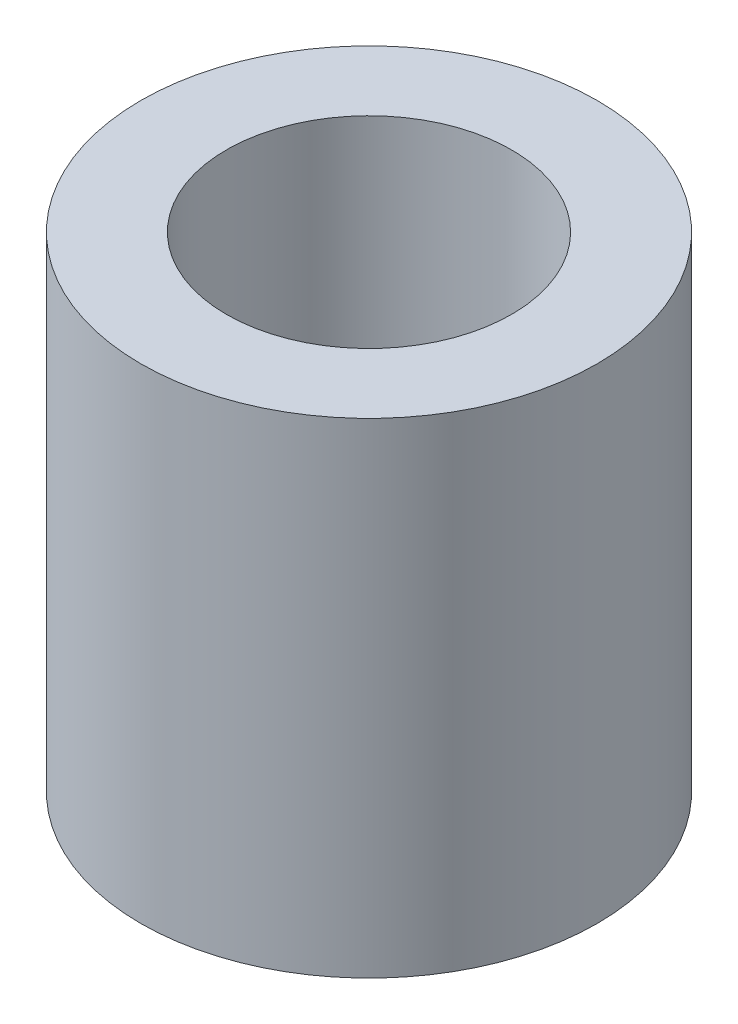
ISO-10303-21;
HEADER;
FILE_DESCRIPTION(('STEP AP214'),'2;1');
FILE_NAME('part.step','',(''),(''),'','','');
FILE_SCHEMA(('AUTOMOTIVE_DESIGN { 1 0 10303 214 1 1 1 1 }'));
ENDSEC;
DATA;
#1=APPLICATION_CONTEXT('core data for automotive mechanical design processes');
#2=APPLICATION_PROTOCOL_DEFINITION('international standard','automotive_design',2000,#1);
#3=PRODUCT_CONTEXT('',#1,'mechanical');
#4=PRODUCT('Part','Part','',(#3));
#5=PRODUCT_RELATED_PRODUCT_CATEGORY('part','',(#4));
#6=PRODUCT_DEFINITION_FORMATION('','',#4);
#7=PRODUCT_DEFINITION_CONTEXT('part definition',#1,'design');
#8=PRODUCT_DEFINITION('design','',#6,#7);
#9=PRODUCT_DEFINITION_SHAPE('','',#8);
#10=(LENGTH_UNIT() NAMED_UNIT(*) SI_UNIT(.MILLI.,.METRE.));
#11=(NAMED_UNIT(*) PLANE_ANGLE_UNIT() SI_UNIT($,.RADIAN.));
#12=(NAMED_UNIT(*) SI_UNIT($,.STERADIAN.) SOLID_ANGLE_UNIT());
#13=UNCERTAINTY_MEASURE_WITH_UNIT(LENGTH_MEASURE(1.E-05),#10,'distance_accuracy_value','');
#14=(GEOMETRIC_REPRESENTATION_CONTEXT(3) GLOBAL_UNCERTAINTY_ASSIGNED_CONTEXT((#13)) GLOBAL_UNIT_ASSIGNED_CONTEXT((#10,
#11,#12)) REPRESENTATION_CONTEXT('',''));
#15=CARTESIAN_POINT('',(0.,0.,0.));
#16=DIRECTION('',(0.,0.,1.));
#17=DIRECTION('',(1.,0.,0.));
#18=AXIS2_PLACEMENT_3D('',#15,#16,#17);
#19=CARTESIAN_POINT('',(0.,8.5,0.));
#20=DIRECTION('',(0.,1.,0.));
#21=DIRECTION('',(0.,0.,1.));
#22=AXIS2_PLACEMENT_3D('',#19,#20,#21);
#23=PLANE('',#22);
#24=CARTESIAN_POINT('',(0.,8.5,0.));
#25=DIRECTION('',(0.,1.,0.));
#26=DIRECTION('',(0.,0.,1.));
#27=AXIS2_PLACEMENT_3D('',#24,#25,#26);
#28=CIRCLE('',#27,4.);
#29=CARTESIAN_POINT('',(0.,8.5,4.));
#30=VERTEX_POINT('',#29);
#31=EDGE_CURVE('E10',#30,#30,#28,.T.);
#32=ORIENTED_EDGE('',*,*,#31,.T.);
#33=EDGE_LOOP('',(#32));
#34=FACE_BOUND('',#33,.T.);
#35=CARTESIAN_POINT('',(0.,8.5,0.));
#36=DIRECTION('',(0.,1.,0.));
#37=DIRECTION('',(0.,0.,1.));
#38=AXIS2_PLACEMENT_3D('',#35,#36,#37);
#39=CIRCLE('',#38,2.5);
#40=CARTESIAN_POINT('',(0.,8.5,2.5));
#41=VERTEX_POINT('',#40);
#42=EDGE_CURVE('E50',#41,#41,#39,.T.);
#43=ORIENTED_EDGE('',*,*,#42,.F.);
#44=EDGE_LOOP('',(#43));
#45=FACE_BOUND('',#44,.T.);
#46=ADVANCED_FACE('F37',(#34,#45),#23,.T.);
#47=CARTESIAN_POINT('',(0.,0.,0.));
#48=DIRECTION('',(0.,1.,0.));
#49=DIRECTION('',(0.,0.,1.));
#50=AXIS2_PLACEMENT_3D('',#47,#48,#49);
#51=PLANE('',#50);
#52=CARTESIAN_POINT('',(0.,0.,0.));
#53=DIRECTION('',(0.,1.,0.));
#54=DIRECTION('',(0.,0.,1.));
#55=AXIS2_PLACEMENT_3D('',#52,#53,#54);
#56=CIRCLE('',#55,4.);
#57=CARTESIAN_POINT('',(0.,0.,4.));
#58=VERTEX_POINT('',#57);
#59=EDGE_CURVE('E41',#58,#58,#56,.T.);
#60=ORIENTED_EDGE('',*,*,#59,.F.);
#61=EDGE_LOOP('',(#60));
#62=FACE_BOUND('',#61,.T.);
#63=CARTESIAN_POINT('',(0.,0.,0.));
#64=DIRECTION('',(0.,1.,0.));
#65=DIRECTION('',(0.,0.,1.));
#66=AXIS2_PLACEMENT_3D('',#63,#64,#65);
#67=CIRCLE('',#66,2.5);
#68=CARTESIAN_POINT('',(0.,0.,2.5));
#69=VERTEX_POINT('',#68);
#70=EDGE_CURVE('E52',#69,#69,#67,.T.);
#71=ORIENTED_EDGE('',*,*,#70,.T.);
#72=EDGE_LOOP('',(#71));
#73=FACE_BOUND('',#72,.T.);
#74=ADVANCED_FACE('F64',(#62,#73),#51,.F.);
#75=CARTESIAN_POINT('',(0.,8.5,0.));
#76=DIRECTION('',(0.,-1.,0.));
#77=DIRECTION('',(0.,0.,-1.));
#78=AXIS2_PLACEMENT_3D('',#75,#76,#77);
#79=CYLINDRICAL_SURFACE('',#78,4.);
#80=ORIENTED_EDGE('',*,*,#31,.F.);
#81=EDGE_LOOP('',(#80));
#82=FACE_BOUND('',#81,.T.);
#83=ORIENTED_EDGE('',*,*,#59,.T.);
#84=EDGE_LOOP('',(#83));
#85=FACE_BOUND('',#84,.T.);
#86=ADVANCED_FACE('F39',(#82,#85),#79,.T.);
#87=CARTESIAN_POINT('',(0.,8.5,0.));
#88=DIRECTION('',(0.,-1.,0.));
#89=DIRECTION('',(0.,0.,-1.));
#90=AXIS2_PLACEMENT_3D('',#87,#88,#89);
#91=CYLINDRICAL_SURFACE('',#90,2.5);
#92=ORIENTED_EDGE('',*,*,#42,.T.);
#93=EDGE_LOOP('',(#92));
#94=FACE_BOUND('',#93,.T.);
#95=ORIENTED_EDGE('',*,*,#70,.F.);
#96=EDGE_LOOP('',(#95));
#97=FACE_BOUND('',#96,.T.);
#98=ADVANCED_FACE('F60',(#94,#97),#91,.F.);
#99=CLOSED_SHELL('',(#46,#74,#86,#98));
#100=MANIFOLD_SOLID_BREP('B2',#99);
#101=ADVANCED_BREP_SHAPE_REPRESENTATION('',(#18,#100),#14);
#102=SHAPE_DEFINITION_REPRESENTATION(#9,#101);
ENDSEC;
END-ISO-10303-21;
